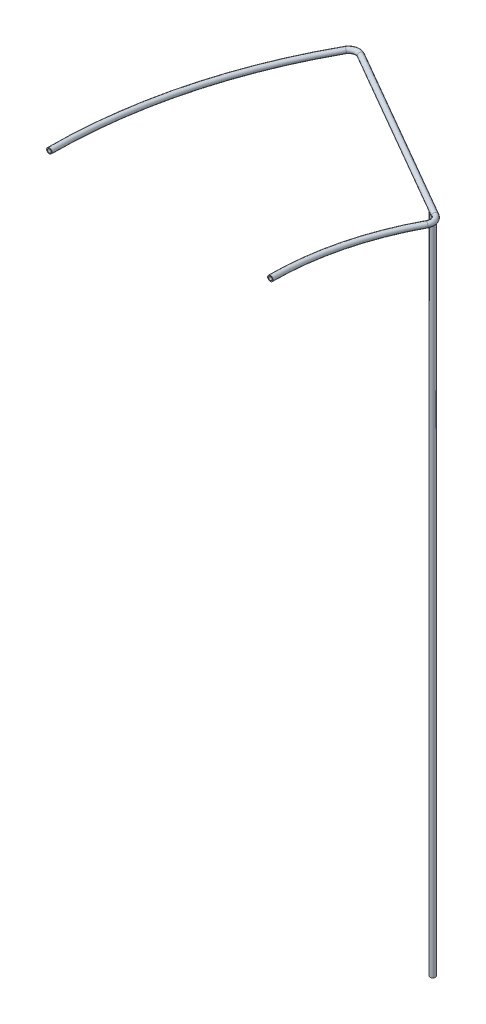
ISO-10303-21;
HEADER;
FILE_DESCRIPTION(('STEP AP214'),'2;1');
FILE_NAME('part.step','',(''),(''),'','','');
FILE_SCHEMA(('AUTOMOTIVE_DESIGN { 1 0 10303 214 1 1 1 1 }'));
ENDSEC;
DATA;
#1=APPLICATION_CONTEXT('core data for automotive mechanical design processes');
#2=APPLICATION_PROTOCOL_DEFINITION('international standard','automotive_design',2000,#1);
#3=PRODUCT_CONTEXT('',#1,'mechanical');
#4=PRODUCT('Part','Part','',(#3));
#5=PRODUCT_RELATED_PRODUCT_CATEGORY('part','',(#4));
#6=PRODUCT_DEFINITION_FORMATION('','',#4);
#7=PRODUCT_DEFINITION_CONTEXT('part definition',#1,'design');
#8=PRODUCT_DEFINITION('design','',#6,#7);
#9=PRODUCT_DEFINITION_SHAPE('','',#8);
#10=(LENGTH_UNIT() NAMED_UNIT(*) SI_UNIT(.MILLI.,.METRE.));
#11=(NAMED_UNIT(*) PLANE_ANGLE_UNIT() SI_UNIT($,.RADIAN.));
#12=(NAMED_UNIT(*) SI_UNIT($,.STERADIAN.) SOLID_ANGLE_UNIT());
#13=UNCERTAINTY_MEASURE_WITH_UNIT(LENGTH_MEASURE(1.E-05),#10,'distance_accuracy_value','');
#14=(GEOMETRIC_REPRESENTATION_CONTEXT(3) GLOBAL_UNCERTAINTY_ASSIGNED_CONTEXT((#13)) GLOBAL_UNIT_ASSIGNED_CONTEXT((#10,
#11,#12)) REPRESENTATION_CONTEXT('',''));
#15=CARTESIAN_POINT('',(0.,0.,0.));
#16=DIRECTION('',(0.,0.,1.));
#17=DIRECTION('',(1.,0.,0.));
#18=AXIS2_PLACEMENT_3D('',#15,#16,#17);
#19=CARTESIAN_POINT('',(-536.656314599951,0.,-309.838667696592));
#20=DIRECTION('',(-0.86602540378444,0.,-0.499999999999997));
#21=DIRECTION('',(-0.499999999999997,0.,0.86602540378444));
#22=AXIS2_PLACEMENT_3D('',#19,#20,#21);
#23=CYLINDRICAL_SURFACE('',#22,6.0000000000001);
#24=CARTESIAN_POINT('',(-935.147047260485,0.,-539.907399467721));
#25=DIRECTION('',(-0.86602540378444,0.,-0.499999999999997));
#26=DIRECTION('',(-0.499999999999997,0.,0.86602540378444));
#27=AXIS2_PLACEMENT_3D('',#24,#25,#26);
#28=CIRCLE('',#27,6.0000000000001);
#29=CARTESIAN_POINT('',(-932.147047260485,0.,-545.103551890428));
#30=VERTEX_POINT('',#29);
#31=EDGE_CURVE('E125',#30,#30,#28,.T.);
#32=ORIENTED_EDGE('',*,*,#31,.F.);
#33=EDGE_LOOP('',(#32));
#34=FACE_BOUND('',#33,.T.);
#35=CARTESIAN_POINT('',(-549.646695656717,0.,-317.338667696592));
#36=DIRECTION('',(-0.612372435695796,0.707106781186548,-0.353553390593272));
#37=DIRECTION('',(-0.612372435695796,-0.707106781186547,-0.353553390593272));
#38=AXIS2_PLACEMENT_3D('',#35,#36,#37);
#39=ELLIPSE('',#38,8.48528137423864,6.00000000000005);
#40=CARTESIAN_POINT('',(-546.646695656717,0.,-322.534820119298));
#41=VERTEX_POINT('',#40);
#42=CARTESIAN_POINT('',(-552.646695656717,0.,-312.142515273885));
#43=VERTEX_POINT('',#42);
#44=EDGE_CURVE('E12',#41,#43,#39,.T.);
#45=ORIENTED_EDGE('',*,*,#44,.T.);
#46=CARTESIAN_POINT('',(-549.646695656717,0.,-317.338667696592));
#47=DIRECTION('',(-0.612372435695796,-0.707106781186548,-0.353553390593271));
#48=DIRECTION('',(-0.612372435695796,0.707106781186548,-0.353553390593271));
#49=AXIS2_PLACEMENT_3D('',#46,#47,#48);
#50=ELLIPSE('',#49,8.48528137423858,6.00000000000001);
#51=EDGE_CURVE('E59',#41,#43,#50,.T.);
#52=ORIENTED_EDGE('',*,*,#51,.F.);
#53=EDGE_LOOP('',(#45,#52));
#54=FACE_BOUND('',#53,.T.);
#55=CARTESIAN_POINT('',(-536.656314599951,0.,-309.838667696592));
#56=DIRECTION('',(-0.866025403784438,0.,-0.500000000000001));
#57=DIRECTION('',(-0.500000000000001,0.,0.866025403784438));
#58=AXIS2_PLACEMENT_3D('',#55,#56,#57);
#59=CIRCLE('',#58,6.0000000000001);
#60=CARTESIAN_POINT('',(-539.656314599951,0.,-304.642515273885));
#61=VERTEX_POINT('',#60);
#62=EDGE_CURVE('E121',#61,#61,#59,.T.);
#63=ORIENTED_EDGE('',*,*,#62,.T.);
#64=EDGE_LOOP('',(#63));
#65=FACE_BOUND('',#64,.T.);
#66=ADVANCED_FACE('F44',(#34,#54,#65),#23,.T.);
#67=CARTESIAN_POINT('',(-600.,0.,-2.98554080839911E-13));
#68=DIRECTION('',(0.,0.,-1.));
#69=DIRECTION('',(-1.,0.,0.));
#70=AXIS2_PLACEMENT_3D('',#67,#68,#69);
#71=PLANE('',#70);
#72=CARTESIAN_POINT('',(-600.,0.,0.));
#73=DIRECTION('',(0.,0.,-1.));
#74=DIRECTION('',(-1.,0.,0.));
#75=AXIS2_PLACEMENT_3D('',#72,#73,#74);
#76=CIRCLE('',#75,4.0000000000001);
#77=CARTESIAN_POINT('',(-604.,0.,0.));
#78=VERTEX_POINT('',#77);
#79=EDGE_CURVE('E81',#78,#78,#76,.T.);
#80=ORIENTED_EDGE('',*,*,#79,.T.);
#81=EDGE_LOOP('',(#80));
#82=FACE_BOUND('',#81,.T.);
#83=CARTESIAN_POINT('',(-600.,0.,-2.98554080839911E-13));
#84=DIRECTION('',(0.,0.,-1.));
#85=DIRECTION('',(-1.,0.,0.));
#86=AXIS2_PLACEMENT_3D('',#83,#84,#85);
#87=CIRCLE('',#86,6.0000000000001);
#88=CARTESIAN_POINT('',(-606.,0.,-3.01539621648311E-13));
#89=VERTEX_POINT('',#88);
#90=EDGE_CURVE('E110',#89,#89,#87,.T.);
#91=ORIENTED_EDGE('',*,*,#90,.F.);
#92=EDGE_LOOP('',(#91));
#93=FACE_BOUND('',#92,.T.);
#94=ADVANCED_FACE('F46',(#82,#93),#71,.F.);
#95=CARTESIAN_POINT('',(-1100.,0.,0.));
#96=DIRECTION('',(0.,0.,1.));
#97=DIRECTION('',(1.,0.,0.));
#98=AXIS2_PLACEMENT_3D('',#95,#96,#97);
#99=PLANE('',#98);
#100=CARTESIAN_POINT('',(-1100.,0.,0.));
#101=DIRECTION('',(0.,0.,1.));
#102=DIRECTION('',(1.,0.,0.));
#103=AXIS2_PLACEMENT_3D('',#100,#101,#102);
#104=CIRCLE('',#103,4.0000000000001);
#105=CARTESIAN_POINT('',(-1104.,0.,0.));
#106=VERTEX_POINT('',#105);
#107=EDGE_CURVE('E76',#106,#106,#104,.T.);
#108=ORIENTED_EDGE('',*,*,#107,.F.);
#109=EDGE_LOOP('',(#108));
#110=FACE_BOUND('',#109,.T.);
#111=CARTESIAN_POINT('',(-1100.,0.,0.));
#112=DIRECTION('',(0.,0.,1.));
#113=DIRECTION('',(1.,0.,0.));
#114=AXIS2_PLACEMENT_3D('',#111,#112,#113);
#115=CIRCLE('',#114,6.0000000000001);
#116=CARTESIAN_POINT('',(-1106.,0.,0.));
#117=VERTEX_POINT('',#116);
#118=EDGE_CURVE('E53',#117,#117,#115,.T.);
#119=ORIENTED_EDGE('',*,*,#118,.T.);
#120=EDGE_LOOP('',(#119));
#121=FACE_BOUND('',#120,.T.);
#122=ADVANCED_FACE('F136',(#110,#121),#99,.T.);
#123=CARTESIAN_POINT('',(0.,0.,0.));
#124=DIRECTION('',(0.,-1.,0.));
#125=DIRECTION('',(0.,0.,-1.));
#126=AXIS2_PLACEMENT_3D('',#123,#124,#125);
#127=TOROIDAL_SURFACE('',#126,600.,6.0000000000001);
#128=CARTESIAN_POINT('',(-529.022239935436,0.,-283.082089955713));
#129=DIRECTION('',(0.471803483259521,0.,-0.881703733225726));
#130=DIRECTION('',(-0.881703733225726,0.,-0.471803483259521));
#131=AXIS2_PLACEMENT_3D('',#128,#129,#130);
#132=CIRCLE('',#131,6.0000000000001);
#133=CARTESIAN_POINT('',(-534.31246233479,0.,-285.91291085527));
#134=VERTEX_POINT('',#133);
#135=EDGE_CURVE('E117',#134,#134,#132,.T.);
#136=CARTESIAN_POINT('',(0.,0.,0.));
#137=DIRECTION('',(0.,-1.,0.));
#138=DIRECTION('',(0.,0.,-1.));
#139=AXIS2_PLACEMENT_3D('',#136,#137,#138);
#140=CIRCLE('',#139,606.);
#141=EDGE_CURVE('',#89,#134,#140,.T.);
#142=ORIENTED_EDGE('',*,*,#90,.T.);
#143=ORIENTED_EDGE('',*,*,#135,.F.);
#144=ORIENTED_EDGE('',*,*,#141,.T.);
#145=ORIENTED_EDGE('',*,*,#141,.F.);
#146=EDGE_LOOP('',(#142,#144,#143,#145));
#147=FACE_BOUND('',#146,.T.);
#148=ADVANCED_FACE('F160',(#147),#127,.T.);
#149=CARTESIAN_POINT('',(-546.65631459995,0.,-292.518159620903));
#150=DIRECTION('',(0.,1.,0.));
#151=DIRECTION('',(0.,0.,1.));
#152=AXIS2_PLACEMENT_3D('',#149,#150,#151);
#153=TOROIDAL_SURFACE('',#152,20.0000000000001,6.0000000000001);
#154=ORIENTED_EDGE('',*,*,#62,.F.);
#155=EDGE_LOOP('',(#154));
#156=FACE_BOUND('',#155,.T.);
#157=ORIENTED_EDGE('',*,*,#135,.T.);
#158=EDGE_LOOP('',(#157));
#159=FACE_BOUND('',#158,.T.);
#160=ADVANCED_FACE('F148',(#156,#159),#153,.T.);
#161=CARTESIAN_POINT('',(-945.147047260484,0.,-522.586891392032));
#162=DIRECTION('',(0.,1.,0.));
#163=DIRECTION('',(0.,0.,1.));
#164=AXIS2_PLACEMENT_3D('',#161,#162,#163);
#165=TOROIDAL_SURFACE('',#164,20.,6.0000000000001);
#166=CARTESIAN_POINT('',(-962.649770357904,0.,-532.264426417806));
#167=DIRECTION('',(-0.483876751288914,0.,0.875136154870821));
#168=DIRECTION('',(0.875136154870821,0.,0.483876751288915));
#169=AXIS2_PLACEMENT_3D('',#166,#167,#168);
#170=CIRCLE('',#169,6.0000000000001);
#171=CARTESIAN_POINT('',(-967.900587287129,0.,-535.167686925538));
#172=VERTEX_POINT('',#171);
#173=EDGE_CURVE('E129',#172,#172,#170,.T.);
#174=CARTESIAN_POINT('',(-945.147047260484,0.,-522.586891392032));
#175=DIRECTION('',(0.,1.,0.));
#176=DIRECTION('',(0.,0.,1.));
#177=AXIS2_PLACEMENT_3D('',#174,#175,#176);
#178=CIRCLE('',#177,26.0000000000001);
#179=EDGE_CURVE('',#30,#172,#178,.T.);
#180=ORIENTED_EDGE('',*,*,#31,.T.);
#181=ORIENTED_EDGE('',*,*,#173,.F.);
#182=ORIENTED_EDGE('',*,*,#179,.T.);
#183=ORIENTED_EDGE('',*,*,#179,.F.);
#184=EDGE_LOOP('',(#180,#182,#181,#183));
#185=FACE_BOUND('',#184,.T.);
#186=ADVANCED_FACE('F142',(#185),#165,.T.);
#187=CARTESIAN_POINT('',(0.,0.,0.));
#188=DIRECTION('',(0.,1.,0.));
#189=DIRECTION('',(0.,0.,1.));
#190=AXIS2_PLACEMENT_3D('',#187,#188,#189);
#191=TOROIDAL_SURFACE('',#190,1100.,6.0000000000001);
#192=CARTESIAN_POINT('',(0.,0.,0.));
#193=DIRECTION('',(0.,1.,0.));
#194=DIRECTION('',(0.,0.,1.));
#195=AXIS2_PLACEMENT_3D('',#192,#193,#194);
#196=CIRCLE('',#195,1106.);
#197=EDGE_CURVE('',#172,#117,#196,.T.);
#198=ORIENTED_EDGE('',*,*,#173,.T.);
#199=ORIENTED_EDGE('',*,*,#118,.F.);
#200=ORIENTED_EDGE('',*,*,#197,.T.);
#201=ORIENTED_EDGE('',*,*,#197,.F.);
#202=EDGE_LOOP('',(#198,#200,#199,#201));
#203=FACE_BOUND('',#202,.T.);
#204=ADVANCED_FACE('F138',(#203),#191,.T.);
#205=CARTESIAN_POINT('',(-549.646695656717,-1500.,-317.338667696592));
#206=DIRECTION('',(0.,1.,0.));
#207=DIRECTION('',(0.,0.,1.));
#208=AXIS2_PLACEMENT_3D('',#205,#206,#207);
#209=PLANE('',#208);
#210=CARTESIAN_POINT('',(-549.646695656717,-1500.,-317.338667696592));
#211=DIRECTION('',(0.,1.,0.));
#212=DIRECTION('',(0.,0.,1.));
#213=AXIS2_PLACEMENT_3D('',#210,#211,#212);
#214=CIRCLE('',#213,4.00000000000001);
#215=CARTESIAN_POINT('',(-549.646695656717,-1500.,-313.338667696592));
#216=VERTEX_POINT('',#215);
#217=EDGE_CURVE('E82',#216,#216,#214,.T.);
#218=ORIENTED_EDGE('',*,*,#217,.T.);
#219=EDGE_LOOP('',(#218));
#220=FACE_BOUND('',#219,.T.);
#221=CARTESIAN_POINT('',(-549.646695656717,-1500.,-317.338667696592));
#222=DIRECTION('',(0.,1.,0.));
#223=DIRECTION('',(0.,0.,1.));
#224=AXIS2_PLACEMENT_3D('',#221,#222,#223);
#225=CIRCLE('',#224,6.00000000000001);
#226=CARTESIAN_POINT('',(-549.646695656717,-1500.,-311.338667696592));
#227=VERTEX_POINT('',#226);
#228=EDGE_CURVE('E75',#227,#227,#225,.T.);
#229=ORIENTED_EDGE('',*,*,#228,.F.);
#230=EDGE_LOOP('',(#229));
#231=FACE_BOUND('',#230,.T.);
#232=ADVANCED_FACE('F141',(#220,#231),#209,.F.);
#233=CARTESIAN_POINT('',(-549.646695656717,14.8315353299544,-317.338667696592));
#234=DIRECTION('',(0.,-1.,0.));
#235=DIRECTION('',(1.,0.,0.));
#236=AXIS2_PLACEMENT_3D('',#233,#234,#235);
#237=CYLINDRICAL_SURFACE('',#236,6.00000000000001);
#238=ORIENTED_EDGE('',*,*,#44,.F.);
#239=ORIENTED_EDGE('',*,*,#51,.T.);
#240=EDGE_LOOP('',(#238,#239));
#241=FACE_BOUND('',#240,.T.);
#242=ORIENTED_EDGE('',*,*,#228,.T.);
#243=EDGE_LOOP('',(#242));
#244=FACE_BOUND('',#243,.T.);
#245=ADVANCED_FACE('F171',(#241,#244),#237,.T.);
#246=CARTESIAN_POINT('',(-536.656314599951,0.,-309.838667696592));
#247=DIRECTION('',(-0.86602540378444,0.,-0.499999999999997));
#248=DIRECTION('',(-0.499999999999997,0.,0.86602540378444));
#249=AXIS2_PLACEMENT_3D('',#246,#247,#248);
#250=CYLINDRICAL_SURFACE('',#249,4.0000000000001);
#251=CARTESIAN_POINT('',(-935.147047260485,0.,-539.907399467721));
#252=DIRECTION('',(0.866025403784446,0.,0.499999999999987));
#253=DIRECTION('',(0.499999999999987,0.,-0.866025403784446));
#254=AXIS2_PLACEMENT_3D('',#251,#252,#253);
#255=CIRCLE('',#254,4.0000000000001);
#256=CARTESIAN_POINT('',(-933.147047260485,0.,-543.371501082859));
#257=VERTEX_POINT('',#256);
#258=EDGE_CURVE('E97',#257,#257,#255,.F.);
#259=ORIENTED_EDGE('',*,*,#258,.T.);
#260=EDGE_LOOP('',(#259));
#261=FACE_BOUND('',#260,.T.);
#262=CARTESIAN_POINT('',(-549.646695656717,0.,-317.338667696592));
#263=DIRECTION('',(-0.612372435695796,0.707106781186548,-0.353553390593272));
#264=DIRECTION('',(-0.612372435695796,-0.707106781186547,-0.353553390593272));
#265=AXIS2_PLACEMENT_3D('',#262,#263,#264);
#266=ELLIPSE('',#265,5.65685424949245,4.00000000000005);
#267=CARTESIAN_POINT('',(-547.646695656717,0.,-320.80276931173));
#268=VERTEX_POINT('',#267);
#269=CARTESIAN_POINT('',(-551.646695656717,0.,-313.874566081454));
#270=VERTEX_POINT('',#269);
#271=EDGE_CURVE('E68',#268,#270,#266,.T.);
#272=ORIENTED_EDGE('',*,*,#271,.F.);
#273=CARTESIAN_POINT('',(-549.646695656717,0.,-317.338667696592));
#274=DIRECTION('',(-0.612372435695796,-0.707106781186547,-0.353553390593272));
#275=DIRECTION('',(0.612372435695796,-0.707106781186548,0.353553390593272));
#276=AXIS2_PLACEMENT_3D('',#273,#274,#275);
#277=ELLIPSE('',#276,5.65685424949245,4.00000000000005);
#278=EDGE_CURVE('E72',#268,#270,#277,.T.);
#279=ORIENTED_EDGE('',*,*,#278,.T.);
#280=EDGE_LOOP('',(#272,#279));
#281=FACE_BOUND('',#280,.T.);
#282=CARTESIAN_POINT('',(-536.656314599951,0.,-309.838667696592));
#283=DIRECTION('',(-0.86602540378444,0.,-0.499999999999997));
#284=DIRECTION('',(-0.499999999999997,0.,0.86602540378444));
#285=AXIS2_PLACEMENT_3D('',#282,#283,#284);
#286=CIRCLE('',#285,4.0000000000001);
#287=CARTESIAN_POINT('',(-538.656314599951,0.,-306.374566081454));
#288=VERTEX_POINT('',#287);
#289=EDGE_CURVE('E93',#288,#288,#286,.T.);
#290=ORIENTED_EDGE('',*,*,#289,.F.);
#291=EDGE_LOOP('',(#290));
#292=FACE_BOUND('',#291,.T.);
#293=ADVANCED_FACE('F70',(#261,#281,#292),#250,.F.);
#294=CARTESIAN_POINT('',(0.,0.,0.));
#295=DIRECTION('',(0.,-1.,0.));
#296=DIRECTION('',(0.,0.,-1.));
#297=AXIS2_PLACEMENT_3D('',#294,#295,#296);
#298=TOROIDAL_SURFACE('',#297,600.,4.0000000000001);
#299=CARTESIAN_POINT('',(-529.022239935436,0.,-283.082089955713));
#300=DIRECTION('',(-0.471803483259513,0.,0.881703733225731));
#301=DIRECTION('',(0.881703733225731,0.,0.471803483259513));
#302=AXIS2_PLACEMENT_3D('',#299,#300,#301);
#303=CIRCLE('',#302,4.0000000000001);
#304=CARTESIAN_POINT('',(-532.549054868339,0.,-284.969303888751));
#305=VERTEX_POINT('',#304);
#306=EDGE_CURVE('E87',#305,#305,#303,.F.);
#307=CARTESIAN_POINT('',(0.,0.,0.));
#308=DIRECTION('',(0.,-1.,0.));
#309=DIRECTION('',(0.,0.,-1.));
#310=AXIS2_PLACEMENT_3D('',#307,#308,#309);
#311=CIRCLE('',#310,604.);
#312=EDGE_CURVE('',#78,#305,#311,.T.);
#313=ORIENTED_EDGE('',*,*,#79,.F.);
#314=ORIENTED_EDGE('',*,*,#306,.T.);
#315=ORIENTED_EDGE('',*,*,#312,.T.);
#316=ORIENTED_EDGE('',*,*,#312,.F.);
#317=EDGE_LOOP('',(#313,#315,#314,#316));
#318=FACE_BOUND('',#317,.T.);
#319=ADVANCED_FACE('F183',(#318),#298,.F.);
#320=CARTESIAN_POINT('',(-546.65631459995,0.,-292.518159620903));
#321=DIRECTION('',(0.,1.,0.));
#322=DIRECTION('',(0.,0.,1.));
#323=AXIS2_PLACEMENT_3D('',#320,#321,#322);
#324=TOROIDAL_SURFACE('',#323,20.0000000000001,4.0000000000001);
#325=ORIENTED_EDGE('',*,*,#289,.T.);
#326=EDGE_LOOP('',(#325));
#327=FACE_BOUND('',#326,.T.);
#328=ORIENTED_EDGE('',*,*,#306,.F.);
#329=EDGE_LOOP('',(#328));
#330=FACE_BOUND('',#329,.T.);
#331=ADVANCED_FACE('F200',(#327,#330),#324,.F.);
#332=CARTESIAN_POINT('',(-945.147047260484,0.,-522.586891392032));
#333=DIRECTION('',(0.,1.,0.));
#334=DIRECTION('',(0.,0.,1.));
#335=AXIS2_PLACEMENT_3D('',#332,#333,#334);
#336=TOROIDAL_SURFACE('',#335,20.,4.0000000000001);
#337=CARTESIAN_POINT('',(-962.649770357903,0.,-532.264426417807));
#338=DIRECTION('',(0.483876751288915,0.,-0.875136154870821));
#339=DIRECTION('',(-0.875136154870821,0.,-0.483876751288915));
#340=AXIS2_PLACEMENT_3D('',#337,#338,#339);
#341=CIRCLE('',#340,4.0000000000001);
#342=CARTESIAN_POINT('',(-966.150314977387,0.,-534.199933422962));
#343=VERTEX_POINT('',#342);
#344=EDGE_CURVE('E101',#343,#343,#341,.F.);
#345=CARTESIAN_POINT('',(-945.147047260484,0.,-522.586891392032));
#346=DIRECTION('',(0.,1.,0.));
#347=DIRECTION('',(0.,0.,1.));
#348=AXIS2_PLACEMENT_3D('',#345,#346,#347);
#349=CIRCLE('',#348,24.0000000000001);
#350=EDGE_CURVE('',#257,#343,#349,.T.);
#351=ORIENTED_EDGE('',*,*,#258,.F.);
#352=ORIENTED_EDGE('',*,*,#344,.T.);
#353=ORIENTED_EDGE('',*,*,#350,.T.);
#354=ORIENTED_EDGE('',*,*,#350,.F.);
#355=EDGE_LOOP('',(#351,#353,#352,#354));
#356=FACE_BOUND('',#355,.T.);
#357=ADVANCED_FACE('F196',(#356),#336,.F.);
#358=CARTESIAN_POINT('',(0.,0.,0.));
#359=DIRECTION('',(0.,1.,0.));
#360=DIRECTION('',(0.,0.,1.));
#361=AXIS2_PLACEMENT_3D('',#358,#359,#360);
#362=TOROIDAL_SURFACE('',#361,1100.,4.0000000000001);
#363=CARTESIAN_POINT('',(0.,0.,0.));
#364=DIRECTION('',(0.,1.,0.));
#365=DIRECTION('',(0.,0.,1.));
#366=AXIS2_PLACEMENT_3D('',#363,#364,#365);
#367=CIRCLE('',#366,1104.);
#368=EDGE_CURVE('',#343,#106,#367,.T.);
#369=ORIENTED_EDGE('',*,*,#344,.F.);
#370=ORIENTED_EDGE('',*,*,#107,.T.);
#371=ORIENTED_EDGE('',*,*,#368,.T.);
#372=ORIENTED_EDGE('',*,*,#368,.F.);
#373=EDGE_LOOP('',(#369,#371,#370,#372));
#374=FACE_BOUND('',#373,.T.);
#375=ADVANCED_FACE('F186',(#374),#362,.F.);
#376=CARTESIAN_POINT('',(-549.646695656717,14.8315353299544,-317.338667696592));
#377=DIRECTION('',(0.,-1.,0.));
#378=DIRECTION('',(1.,0.,0.));
#379=AXIS2_PLACEMENT_3D('',#376,#377,#378);
#380=CYLINDRICAL_SURFACE('',#379,4.00000000000001);
#381=ORIENTED_EDGE('',*,*,#271,.T.);
#382=ORIENTED_EDGE('',*,*,#278,.F.);
#383=EDGE_LOOP('',(#381,#382));
#384=FACE_BOUND('',#383,.T.);
#385=ORIENTED_EDGE('',*,*,#217,.F.);
#386=EDGE_LOOP('',(#385));
#387=FACE_BOUND('',#386,.T.);
#388=ADVANCED_FACE('F78',(#384,#387),#380,.F.);
#389=CLOSED_SHELL('',(#66,#94,#122,#148,#160,#186,#204,#232,#245,#293,#319,#331,#357,#375,#388));
#390=MANIFOLD_SOLID_BREP('B2',#389);
#391=ADVANCED_BREP_SHAPE_REPRESENTATION('',(#18,#390),#14);
#392=SHAPE_DEFINITION_REPRESENTATION(#9,#391);
ENDSEC;
END-ISO-10303-21;
